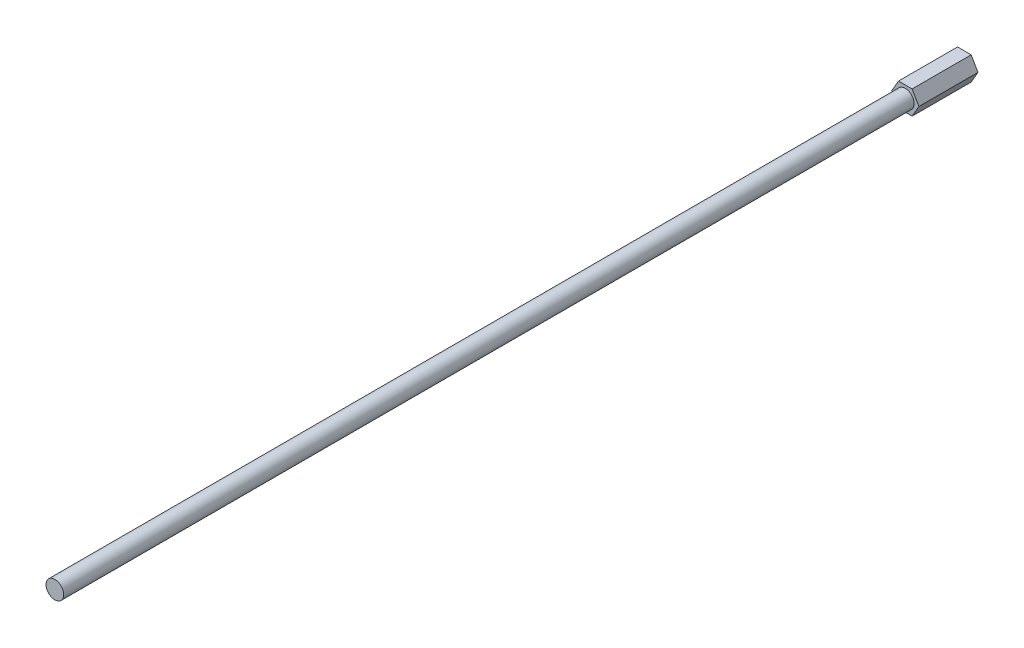
ISO-10303-21;
HEADER;
FILE_DESCRIPTION(('STEP AP214'),'2;1');
FILE_NAME('part.step','',(''),(''),'','','');
FILE_SCHEMA(('AUTOMOTIVE_DESIGN { 1 0 10303 214 1 1 1 1 }'));
ENDSEC;
DATA;
#1=APPLICATION_CONTEXT('core data for automotive mechanical design processes');
#2=APPLICATION_PROTOCOL_DEFINITION('international standard','automotive_design',2000,#1);
#3=PRODUCT_CONTEXT('',#1,'mechanical');
#4=PRODUCT('Part','Part','',(#3));
#5=PRODUCT_RELATED_PRODUCT_CATEGORY('part','',(#4));
#6=PRODUCT_DEFINITION_FORMATION('','',#4);
#7=PRODUCT_DEFINITION_CONTEXT('part definition',#1,'design');
#8=PRODUCT_DEFINITION('design','',#6,#7);
#9=PRODUCT_DEFINITION_SHAPE('','',#8);
#10=(LENGTH_UNIT() NAMED_UNIT(*) SI_UNIT(.MILLI.,.METRE.));
#11=(NAMED_UNIT(*) PLANE_ANGLE_UNIT() SI_UNIT($,.RADIAN.));
#12=(NAMED_UNIT(*) SI_UNIT($,.STERADIAN.) SOLID_ANGLE_UNIT());
#13=UNCERTAINTY_MEASURE_WITH_UNIT(LENGTH_MEASURE(1.E-05),#10,'distance_accuracy_value','');
#14=(GEOMETRIC_REPRESENTATION_CONTEXT(3) GLOBAL_UNCERTAINTY_ASSIGNED_CONTEXT((#13)) GLOBAL_UNIT_ASSIGNED_CONTEXT((#10,
#11,#12)) REPRESENTATION_CONTEXT('',''));
#15=CARTESIAN_POINT('',(0.,0.,0.));
#16=DIRECTION('',(0.,0.,1.));
#17=DIRECTION('',(1.,0.,0.));
#18=AXIS2_PLACEMENT_3D('',#15,#16,#17);
#19=CARTESIAN_POINT('',(3.6661742093542,-6.34999999999996,31.75));
#20=DIRECTION('',(-0.866025403784441,0.499999999999995,0.));
#21=DIRECTION('',(-0.499999999999995,-0.866025403784441,0.));
#22=AXIS2_PLACEMENT_3D('',#19,#20,#21);
#23=PLANE('',#22);
#24=DIRECTION('',(0.499999999999995,0.866025403784441,0.));
#25=VECTOR('',#24,1.);
#26=CARTESIAN_POINT('',(3.6661742093542,-6.34999999999996,0.));
#27=LINE('',#26,#25);
#28=CARTESIAN_POINT('',(3.6661742093542,-6.34999999999996,0.));
#29=VERTEX_POINT('',#28);
#30=CARTESIAN_POINT('',(7.33234841870825,0.,0.));
#31=VERTEX_POINT('',#30);
#32=EDGE_CURVE('E123',#29,#31,#27,.T.);
#33=ORIENTED_EDGE('',*,*,#32,.T.);
#34=DIRECTION('',(0.,0.,-1.));
#35=VECTOR('',#34,1.);
#36=CARTESIAN_POINT('',(7.33234841870825,0.,31.75));
#37=LINE('',#36,#35);
#38=CARTESIAN_POINT('',(7.33234841870825,0.,31.75));
#39=VERTEX_POINT('',#38);
#40=EDGE_CURVE('E40',#39,#31,#37,.T.);
#41=ORIENTED_EDGE('',*,*,#40,.F.);
#42=DIRECTION('',(0.499999999999995,0.866025403784441,0.));
#43=VECTOR('',#42,1.);
#44=CARTESIAN_POINT('',(3.6661742093542,-6.34999999999996,31.75));
#45=LINE('',#44,#43);
#46=CARTESIAN_POINT('',(3.6661742093542,-6.34999999999996,31.75));
#47=VERTEX_POINT('',#46);
#48=EDGE_CURVE('E134',#47,#39,#45,.T.);
#49=ORIENTED_EDGE('',*,*,#48,.F.);
#50=DIRECTION('',(0.,0.,-1.));
#51=VECTOR('',#50,1.);
#52=CARTESIAN_POINT('',(3.6661742093542,-6.34999999999996,31.75));
#53=LINE('',#52,#51);
#54=EDGE_CURVE('E119',#47,#29,#53,.T.);
#55=ORIENTED_EDGE('',*,*,#54,.T.);
#56=EDGE_LOOP('',(#33,#41,#49,#55));
#57=FACE_BOUND('',#56,.T.);
#58=ADVANCED_FACE('F37',(#57),#23,.F.);
#59=CARTESIAN_POINT('',(7.33234841870825,0.,31.75));
#60=DIRECTION('',(-0.866025403784438,-0.500000000000001,0.));
#61=DIRECTION('',(0.500000000000001,-0.866025403784438,0.));
#62=AXIS2_PLACEMENT_3D('',#59,#60,#61);
#63=PLANE('',#62);
#64=DIRECTION('',(-0.500000000000001,0.866025403784438,0.));
#65=VECTOR('',#64,1.);
#66=CARTESIAN_POINT('',(7.33234841870825,0.,0.));
#67=LINE('',#66,#65);
#68=CARTESIAN_POINT('',(3.66617420935411,6.35000000000001,0.));
#69=VERTEX_POINT('',#68);
#70=EDGE_CURVE('E126',#31,#69,#67,.T.);
#71=ORIENTED_EDGE('',*,*,#70,.T.);
#72=DIRECTION('',(0.,0.,-1.));
#73=VECTOR('',#72,1.);
#74=CARTESIAN_POINT('',(3.66617420935411,6.35000000000001,31.75));
#75=LINE('',#74,#73);
#76=CARTESIAN_POINT('',(3.66617420935411,6.35000000000001,31.75));
#77=VERTEX_POINT('',#76);
#78=EDGE_CURVE('E137',#77,#69,#75,.T.);
#79=ORIENTED_EDGE('',*,*,#78,.F.);
#80=DIRECTION('',(-0.500000000000001,0.866025403784438,0.));
#81=VECTOR('',#80,1.);
#82=CARTESIAN_POINT('',(7.33234841870825,0.,31.75));
#83=LINE('',#82,#81);
#84=EDGE_CURVE('E92',#39,#77,#83,.T.);
#85=ORIENTED_EDGE('',*,*,#84,.F.);
#86=ORIENTED_EDGE('',*,*,#40,.T.);
#87=EDGE_LOOP('',(#71,#79,#85,#86));
#88=FACE_BOUND('',#87,.T.);
#89=ADVANCED_FACE('F142',(#88),#63,.F.);
#90=CARTESIAN_POINT('',(3.66617420935411,6.35000000000001,31.75));
#91=DIRECTION('',(0.,-1.,0.));
#92=DIRECTION('',(1.,0.,0.));
#93=AXIS2_PLACEMENT_3D('',#90,#91,#92);
#94=PLANE('',#93);
#95=DIRECTION('',(-1.,0.,0.));
#96=VECTOR('',#95,1.);
#97=CARTESIAN_POINT('',(3.66617420935411,6.35000000000001,0.));
#98=LINE('',#97,#96);
#99=CARTESIAN_POINT('',(-3.66617420935415,6.34999999999999,0.));
#100=VERTEX_POINT('',#99);
#101=EDGE_CURVE('E129',#69,#100,#98,.T.);
#102=ORIENTED_EDGE('',*,*,#101,.T.);
#103=DIRECTION('',(0.,0.,-1.));
#104=VECTOR('',#103,1.);
#105=CARTESIAN_POINT('',(-3.66617420935415,6.34999999999999,31.75));
#106=LINE('',#105,#104);
#107=CARTESIAN_POINT('',(-3.66617420935415,6.34999999999999,31.75));
#108=VERTEX_POINT('',#107);
#109=EDGE_CURVE('E114',#108,#100,#106,.T.);
#110=ORIENTED_EDGE('',*,*,#109,.F.);
#111=DIRECTION('',(-1.,0.,0.));
#112=VECTOR('',#111,1.);
#113=CARTESIAN_POINT('',(3.66617420935411,6.35000000000001,31.75));
#114=LINE('',#113,#112);
#115=EDGE_CURVE('E105',#77,#108,#114,.T.);
#116=ORIENTED_EDGE('',*,*,#115,.F.);
#117=ORIENTED_EDGE('',*,*,#78,.T.);
#118=EDGE_LOOP('',(#102,#110,#116,#117));
#119=FACE_BOUND('',#118,.T.);
#120=ADVANCED_FACE('F148',(#119),#94,.F.);
#121=CARTESIAN_POINT('',(-3.66617420935415,6.34999999999999,31.75));
#122=DIRECTION('',(0.866025403784442,-0.499999999999995,0.));
#123=DIRECTION('',(0.499999999999995,0.866025403784442,0.));
#124=AXIS2_PLACEMENT_3D('',#121,#122,#123);
#125=PLANE('',#124);
#126=DIRECTION('',(-0.499999999999995,-0.866025403784442,0.));
#127=VECTOR('',#126,1.);
#128=CARTESIAN_POINT('',(-3.66617420935415,6.34999999999999,0.));
#129=LINE('',#128,#127);
#130=CARTESIAN_POINT('',(-7.33234841870825,0.,0.));
#131=VERTEX_POINT('',#130);
#132=EDGE_CURVE('E113',#100,#131,#129,.T.);
#133=ORIENTED_EDGE('',*,*,#132,.T.);
#134=DIRECTION('',(0.,0.,-1.));
#135=VECTOR('',#134,1.);
#136=CARTESIAN_POINT('',(-7.33234841870825,0.,31.75));
#137=LINE('',#136,#135);
#138=CARTESIAN_POINT('',(-7.33234841870825,0.,31.75));
#139=VERTEX_POINT('',#138);
#140=EDGE_CURVE('E110',#139,#131,#137,.T.);
#141=ORIENTED_EDGE('',*,*,#140,.F.);
#142=DIRECTION('',(-0.499999999999995,-0.866025403784442,0.));
#143=VECTOR('',#142,1.);
#144=CARTESIAN_POINT('',(-3.66617420935415,6.34999999999999,31.75));
#145=LINE('',#144,#143);
#146=EDGE_CURVE('E99',#108,#139,#145,.T.);
#147=ORIENTED_EDGE('',*,*,#146,.F.);
#148=ORIENTED_EDGE('',*,*,#109,.T.);
#149=EDGE_LOOP('',(#133,#141,#147,#148));
#150=FACE_BOUND('',#149,.T.);
#151=ADVANCED_FACE('F111',(#150),#125,.F.);
#152=CARTESIAN_POINT('',(-7.33234841870825,0.,31.75));
#153=DIRECTION('',(0.866025403784434,0.500000000000007,0.));
#154=DIRECTION('',(-0.500000000000007,0.866025403784435,0.));
#155=AXIS2_PLACEMENT_3D('',#152,#153,#154);
#156=PLANE('',#155);
#157=DIRECTION('',(0.500000000000007,-0.866025403784434,0.));
#158=VECTOR('',#157,1.);
#159=CARTESIAN_POINT('',(-7.33234841870825,0.,0.));
#160=LINE('',#159,#158);
#161=CARTESIAN_POINT('',(-3.66617420935407,-6.35000000000004,0.));
#162=VERTEX_POINT('',#161);
#163=EDGE_CURVE('E77',#131,#162,#160,.T.);
#164=ORIENTED_EDGE('',*,*,#163,.T.);
#165=DIRECTION('',(0.,0.,-1.));
#166=VECTOR('',#165,1.);
#167=CARTESIAN_POINT('',(-3.66617420935407,-6.35000000000004,31.75));
#168=LINE('',#167,#166);
#169=CARTESIAN_POINT('',(-3.66617420935407,-6.35000000000004,31.75));
#170=VERTEX_POINT('',#169);
#171=EDGE_CURVE('E115',#170,#162,#168,.T.);
#172=ORIENTED_EDGE('',*,*,#171,.F.);
#173=DIRECTION('',(0.500000000000007,-0.866025403784434,0.));
#174=VECTOR('',#173,1.);
#175=CARTESIAN_POINT('',(-7.33234841870825,0.,31.75));
#176=LINE('',#175,#174);
#177=EDGE_CURVE('E103',#139,#170,#176,.T.);
#178=ORIENTED_EDGE('',*,*,#177,.F.);
#179=ORIENTED_EDGE('',*,*,#140,.T.);
#180=EDGE_LOOP('',(#164,#172,#178,#179));
#181=FACE_BOUND('',#180,.T.);
#182=ADVANCED_FACE('F117',(#181),#156,.F.);
#183=CARTESIAN_POINT('',(-3.66617420935407,-6.35000000000004,31.75));
#184=DIRECTION('',(0.,1.,0.));
#185=DIRECTION('',(-1.,0.,0.));
#186=AXIS2_PLACEMENT_3D('',#183,#184,#185);
#187=PLANE('',#186);
#188=DIRECTION('',(1.,0.,0.));
#189=VECTOR('',#188,1.);
#190=CARTESIAN_POINT('',(-3.66617420935407,-6.35000000000004,0.));
#191=LINE('',#190,#189);
#192=EDGE_CURVE('E83',#162,#29,#191,.T.);
#193=ORIENTED_EDGE('',*,*,#192,.T.);
#194=ORIENTED_EDGE('',*,*,#54,.F.);
#195=DIRECTION('',(1.,0.,0.));
#196=VECTOR('',#195,1.);
#197=CARTESIAN_POINT('',(-3.66617420935407,-6.35000000000004,31.75));
#198=LINE('',#197,#196);
#199=EDGE_CURVE('E54',#170,#47,#198,.T.);
#200=ORIENTED_EDGE('',*,*,#199,.F.);
#201=ORIENTED_EDGE('',*,*,#171,.T.);
#202=EDGE_LOOP('',(#193,#194,#200,#201));
#203=FACE_BOUND('',#202,.T.);
#204=ADVANCED_FACE('F164',(#203),#187,.F.);
#205=CARTESIAN_POINT('',(0.,0.,31.75));
#206=DIRECTION('',(0.,0.,1.));
#207=DIRECTION('',(1.,0.,0.));
#208=AXIS2_PLACEMENT_3D('',#205,#206,#207);
#209=PLANE('',#208);
#210=CARTESIAN_POINT('',(0.,0.,31.75));
#211=DIRECTION('',(0.,0.,1.));
#212=DIRECTION('',(1.,0.,0.));
#213=AXIS2_PLACEMENT_3D('',#210,#211,#212);
#214=CIRCLE('',#213,4.7625);
#215=CARTESIAN_POINT('',(4.7625,0.,31.75));
#216=VERTEX_POINT('',#215);
#217=EDGE_CURVE('E11',#216,#216,#214,.T.);
#218=ORIENTED_EDGE('',*,*,#217,.F.);
#219=EDGE_LOOP('',(#218));
#220=FACE_BOUND('',#219,.T.);
#221=ORIENTED_EDGE('',*,*,#48,.T.);
#222=ORIENTED_EDGE('',*,*,#84,.T.);
#223=ORIENTED_EDGE('',*,*,#115,.T.);
#224=ORIENTED_EDGE('',*,*,#146,.T.);
#225=ORIENTED_EDGE('',*,*,#177,.T.);
#226=ORIENTED_EDGE('',*,*,#199,.T.);
#227=EDGE_LOOP('',(#221,#222,#223,#224,#225,#226));
#228=FACE_BOUND('',#227,.T.);
#229=ADVANCED_FACE('F101',(#220,#228),#209,.T.);
#230=CARTESIAN_POINT('',(0.,0.,0.));
#231=DIRECTION('',(0.,0.,1.));
#232=DIRECTION('',(1.,0.,0.));
#233=AXIS2_PLACEMENT_3D('',#230,#231,#232);
#234=PLANE('',#233);
#235=ORIENTED_EDGE('',*,*,#32,.F.);
#236=ORIENTED_EDGE('',*,*,#192,.F.);
#237=ORIENTED_EDGE('',*,*,#163,.F.);
#238=ORIENTED_EDGE('',*,*,#132,.F.);
#239=ORIENTED_EDGE('',*,*,#101,.F.);
#240=ORIENTED_EDGE('',*,*,#70,.F.);
#241=EDGE_LOOP('',(#235,#236,#237,#238,#239,#240));
#242=FACE_BOUND('',#241,.T.);
#243=ADVANCED_FACE('F147',(#242),#234,.F.);
#244=CARTESIAN_POINT('',(0.,0.,488.95));
#245=DIRECTION('',(0.,0.,-1.));
#246=DIRECTION('',(-1.,0.,0.));
#247=AXIS2_PLACEMENT_3D('',#244,#245,#246);
#248=CYLINDRICAL_SURFACE('',#247,4.7625);
#249=CARTESIAN_POINT('',(0.,0.,488.95));
#250=DIRECTION('',(0.,0.,1.));
#251=DIRECTION('',(1.,0.,0.));
#252=AXIS2_PLACEMENT_3D('',#249,#250,#251);
#253=CIRCLE('',#252,4.7625);
#254=CARTESIAN_POINT('',(4.7625,0.,488.95));
#255=VERTEX_POINT('',#254);
#256=EDGE_CURVE('E127',#255,#255,#253,.T.);
#257=ORIENTED_EDGE('',*,*,#256,.F.);
#258=EDGE_LOOP('',(#257));
#259=FACE_BOUND('',#258,.T.);
#260=ORIENTED_EDGE('',*,*,#217,.T.);
#261=EDGE_LOOP('',(#260));
#262=FACE_BOUND('',#261,.T.);
#263=ADVANCED_FACE('F157',(#259,#262),#248,.T.);
#264=CARTESIAN_POINT('',(0.,0.,488.95));
#265=DIRECTION('',(0.,0.,1.));
#266=DIRECTION('',(1.,0.,0.));
#267=AXIS2_PLACEMENT_3D('',#264,#265,#266);
#268=PLANE('',#267);
#269=ORIENTED_EDGE('',*,*,#256,.T.);
#270=EDGE_LOOP('',(#269));
#271=FACE_BOUND('',#270,.T.);
#272=ADVANCED_FACE('F155',(#271),#268,.T.);
#273=CLOSED_SHELL('',(#58,#89,#120,#151,#182,#204,#229,#243,#263,#272));
#274=MANIFOLD_SOLID_BREP('B2',#273);
#275=ADVANCED_BREP_SHAPE_REPRESENTATION('',(#18,#274),#14);
#276=SHAPE_DEFINITION_REPRESENTATION(#9,#275);
ENDSEC;
END-ISO-10303-21;
